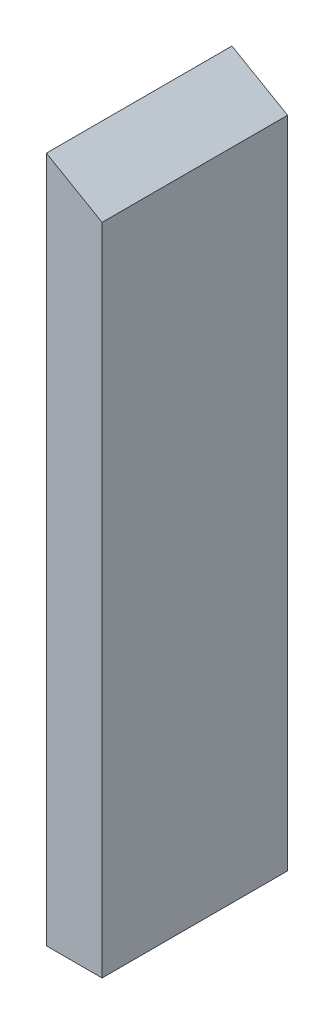
ISO-10303-21;
HEADER;
FILE_DESCRIPTION(('STEP AP214'),'2;1');
FILE_NAME('part.step','',(''),(''),'','','');
FILE_SCHEMA(('AUTOMOTIVE_DESIGN { 1 0 10303 214 1 1 1 1 }'));
ENDSEC;
DATA;
#1=APPLICATION_CONTEXT('core data for automotive mechanical design processes');
#2=APPLICATION_PROTOCOL_DEFINITION('international standard','automotive_design',2000,#1);
#3=PRODUCT_CONTEXT('',#1,'mechanical');
#4=PRODUCT('Part','Part','',(#3));
#5=PRODUCT_RELATED_PRODUCT_CATEGORY('part','',(#4));
#6=PRODUCT_DEFINITION_FORMATION('','',#4);
#7=PRODUCT_DEFINITION_CONTEXT('part definition',#1,'design');
#8=PRODUCT_DEFINITION('design','',#6,#7);
#9=PRODUCT_DEFINITION_SHAPE('','',#8);
#10=(LENGTH_UNIT() NAMED_UNIT(*) SI_UNIT(.MILLI.,.METRE.));
#11=(NAMED_UNIT(*) PLANE_ANGLE_UNIT() SI_UNIT($,.RADIAN.));
#12=(NAMED_UNIT(*) SI_UNIT($,.STERADIAN.) SOLID_ANGLE_UNIT());
#13=UNCERTAINTY_MEASURE_WITH_UNIT(LENGTH_MEASURE(1.E-05),#10,'distance_accuracy_value','');
#14=(GEOMETRIC_REPRESENTATION_CONTEXT(3) GLOBAL_UNCERTAINTY_ASSIGNED_CONTEXT((#13)) GLOBAL_UNIT_ASSIGNED_CONTEXT((#10,
#11,#12)) REPRESENTATION_CONTEXT('',''));
#15=CARTESIAN_POINT('',(0.,0.,0.));
#16=DIRECTION('',(0.,0.,1.));
#17=DIRECTION('',(1.,0.,0.));
#18=AXIS2_PLACEMENT_3D('',#15,#16,#17);
#19=CARTESIAN_POINT('',(-19.4360568926305,59.5793961777386,10.));
#20=DIRECTION('',(1.,0.,0.));
#21=DIRECTION('',(0.,1.,0.));
#22=AXIS2_PLACEMENT_3D('',#19,#20,#21);
#23=PLANE('',#22);
#24=DIRECTION('',(0.,-1.,0.));
#25=VECTOR('',#24,1.);
#26=CARTESIAN_POINT('',(-19.4360568926305,59.5793961777386,0.));
#27=LINE('',#26,#25);
#28=CARTESIAN_POINT('',(-19.4360568926305,59.5793961777386,0.));
#29=VERTEX_POINT('',#28);
#30=CARTESIAN_POINT('',(-19.4360568926305,22.5793961777386,0.));
#31=VERTEX_POINT('',#30);
#32=EDGE_CURVE('E116',#29,#31,#27,.T.);
#33=ORIENTED_EDGE('',*,*,#32,.T.);
#34=DIRECTION('',(0.,0.,-1.));
#35=VECTOR('',#34,1.);
#36=CARTESIAN_POINT('',(-19.4360568926305,22.5793961777386,10.));
#37=LINE('',#36,#35);
#38=CARTESIAN_POINT('',(-19.4360568926305,22.5793961777386,10.));
#39=VERTEX_POINT('',#38);
#40=EDGE_CURVE('E12',#39,#31,#37,.T.);
#41=ORIENTED_EDGE('',*,*,#40,.F.);
#42=DIRECTION('',(0.,-1.,0.));
#43=VECTOR('',#42,1.);
#44=CARTESIAN_POINT('',(-19.4360568926305,59.5793961777386,10.));
#45=LINE('',#44,#43);
#46=CARTESIAN_POINT('',(-19.4360568926305,59.5793961777386,10.));
#47=VERTEX_POINT('',#46);
#48=EDGE_CURVE('E89',#47,#39,#45,.T.);
#49=ORIENTED_EDGE('',*,*,#48,.F.);
#50=DIRECTION('',(0.,0.,-1.));
#51=VECTOR('',#50,1.);
#52=CARTESIAN_POINT('',(-19.4360568926305,59.5793961777386,10.));
#53=LINE('',#52,#51);
#54=EDGE_CURVE('E100',#47,#29,#53,.T.);
#55=ORIENTED_EDGE('',*,*,#54,.T.);
#56=EDGE_LOOP('',(#33,#41,#49,#55));
#57=FACE_BOUND('',#56,.T.);
#58=ADVANCED_FACE('F39',(#57),#23,.F.);
#59=CARTESIAN_POINT('',(-19.4360568926305,22.5793961777386,10.));
#60=DIRECTION('',(0.,1.,0.));
#61=DIRECTION('',(0.,0.,1.));
#62=AXIS2_PLACEMENT_3D('',#59,#60,#61);
#63=PLANE('',#62);
#64=DIRECTION('',(1.,0.,0.));
#65=VECTOR('',#64,1.);
#66=CARTESIAN_POINT('',(-19.4360568926305,22.5793961777386,0.));
#67=LINE('',#66,#65);
#68=CARTESIAN_POINT('',(-16.4360568926305,22.5793961777386,0.));
#69=VERTEX_POINT('',#68);
#70=EDGE_CURVE('E93',#31,#69,#67,.T.);
#71=ORIENTED_EDGE('',*,*,#70,.T.);
#72=DIRECTION('',(0.,0.,-1.));
#73=VECTOR('',#72,1.);
#74=CARTESIAN_POINT('',(-16.4360568926305,22.5793961777386,10.));
#75=LINE('',#74,#73);
#76=CARTESIAN_POINT('',(-16.4360568926305,22.5793961777386,10.));
#77=VERTEX_POINT('',#76);
#78=EDGE_CURVE('E46',#77,#69,#75,.T.);
#79=ORIENTED_EDGE('',*,*,#78,.F.);
#80=DIRECTION('',(1.,0.,0.));
#81=VECTOR('',#80,1.);
#82=CARTESIAN_POINT('',(-19.4360568926305,22.5793961777386,10.));
#83=LINE('',#82,#81);
#84=EDGE_CURVE('E84',#39,#77,#83,.T.);
#85=ORIENTED_EDGE('',*,*,#84,.F.);
#86=ORIENTED_EDGE('',*,*,#40,.T.);
#87=EDGE_LOOP('',(#71,#79,#85,#86));
#88=FACE_BOUND('',#87,.T.);
#89=ADVANCED_FACE('F92',(#88),#63,.F.);
#90=CARTESIAN_POINT('',(-16.4360568926305,57.8473453701697,10.));
#91=DIRECTION('',(-1.,0.,0.));
#92=DIRECTION('',(0.,-1.,0.));
#93=AXIS2_PLACEMENT_3D('',#90,#91,#92);
#94=PLANE('',#93);
#95=DIRECTION('',(0.,1.,0.));
#96=VECTOR('',#95,1.);
#97=CARTESIAN_POINT('',(-16.4360568926305,57.8473453701697,0.));
#98=LINE('',#97,#96);
#99=CARTESIAN_POINT('',(-16.4360568926305,57.8473453701697,0.));
#100=VERTEX_POINT('',#99);
#101=EDGE_CURVE('E71',#69,#100,#98,.T.);
#102=ORIENTED_EDGE('',*,*,#101,.T.);
#103=DIRECTION('',(0.,0.,-1.));
#104=VECTOR('',#103,1.);
#105=CARTESIAN_POINT('',(-16.4360568926305,57.8473453701697,10.));
#106=LINE('',#105,#104);
#107=CARTESIAN_POINT('',(-16.4360568926305,57.8473453701697,10.));
#108=VERTEX_POINT('',#107);
#109=EDGE_CURVE('E95',#108,#100,#106,.T.);
#110=ORIENTED_EDGE('',*,*,#109,.F.);
#111=DIRECTION('',(0.,1.,0.));
#112=VECTOR('',#111,1.);
#113=CARTESIAN_POINT('',(-16.4360568926305,57.8473453701697,10.));
#114=LINE('',#113,#112);
#115=EDGE_CURVE('E87',#77,#108,#114,.T.);
#116=ORIENTED_EDGE('',*,*,#115,.F.);
#117=ORIENTED_EDGE('',*,*,#78,.T.);
#118=EDGE_LOOP('',(#102,#110,#116,#117));
#119=FACE_BOUND('',#118,.T.);
#120=ADVANCED_FACE('F96',(#119),#94,.F.);
#121=CARTESIAN_POINT('',(-19.4360568926305,59.5793961777386,10.));
#122=DIRECTION('',(-0.499999999999997,-0.86602540378444,0.));
#123=DIRECTION('',(0.86602540378444,-0.499999999999997,0.));
#124=AXIS2_PLACEMENT_3D('',#121,#122,#123);
#125=PLANE('',#124);
#126=DIRECTION('',(-0.86602540378444,0.499999999999997,0.));
#127=VECTOR('',#126,1.);
#128=CARTESIAN_POINT('',(-19.4360568926305,59.5793961777386,0.));
#129=LINE('',#128,#127);
#130=EDGE_CURVE('E77',#100,#29,#129,.T.);
#131=ORIENTED_EDGE('',*,*,#130,.T.);
#132=ORIENTED_EDGE('',*,*,#54,.F.);
#133=DIRECTION('',(-0.86602540378444,0.499999999999997,0.));
#134=VECTOR('',#133,1.);
#135=CARTESIAN_POINT('',(-19.4360568926305,59.5793961777386,10.));
#136=LINE('',#135,#134);
#137=EDGE_CURVE('E54',#108,#47,#136,.T.);
#138=ORIENTED_EDGE('',*,*,#137,.F.);
#139=ORIENTED_EDGE('',*,*,#109,.T.);
#140=EDGE_LOOP('',(#131,#132,#138,#139));
#141=FACE_BOUND('',#140,.T.);
#142=ADVANCED_FACE('F127',(#141),#125,.F.);
#143=CARTESIAN_POINT('',(0.,0.,10.));
#144=DIRECTION('',(0.,0.,1.));
#145=DIRECTION('',(1.,0.,0.));
#146=AXIS2_PLACEMENT_3D('',#143,#144,#145);
#147=PLANE('',#146);
#148=ORIENTED_EDGE('',*,*,#48,.T.);
#149=ORIENTED_EDGE('',*,*,#84,.T.);
#150=ORIENTED_EDGE('',*,*,#115,.T.);
#151=ORIENTED_EDGE('',*,*,#137,.T.);
#152=EDGE_LOOP('',(#148,#149,#150,#151));
#153=FACE_BOUND('',#152,.T.);
#154=ADVANCED_FACE('F85',(#153),#147,.T.);
#155=CARTESIAN_POINT('',(0.,0.,0.));
#156=DIRECTION('',(0.,0.,1.));
#157=DIRECTION('',(1.,0.,0.));
#158=AXIS2_PLACEMENT_3D('',#155,#156,#157);
#159=PLANE('',#158);
#160=ORIENTED_EDGE('',*,*,#32,.F.);
#161=ORIENTED_EDGE('',*,*,#130,.F.);
#162=ORIENTED_EDGE('',*,*,#101,.F.);
#163=ORIENTED_EDGE('',*,*,#70,.F.);
#164=EDGE_LOOP('',(#160,#161,#162,#163));
#165=FACE_BOUND('',#164,.T.);
#166=ADVANCED_FACE('F121',(#165),#159,.F.);
#167=CLOSED_SHELL('',(#58,#89,#120,#142,#154,#166));
#168=MANIFOLD_SOLID_BREP('B2',#167);
#169=ADVANCED_BREP_SHAPE_REPRESENTATION('',(#18,#168),#14);
#170=SHAPE_DEFINITION_REPRESENTATION(#9,#169);
ENDSEC;
END-ISO-10303-21;
